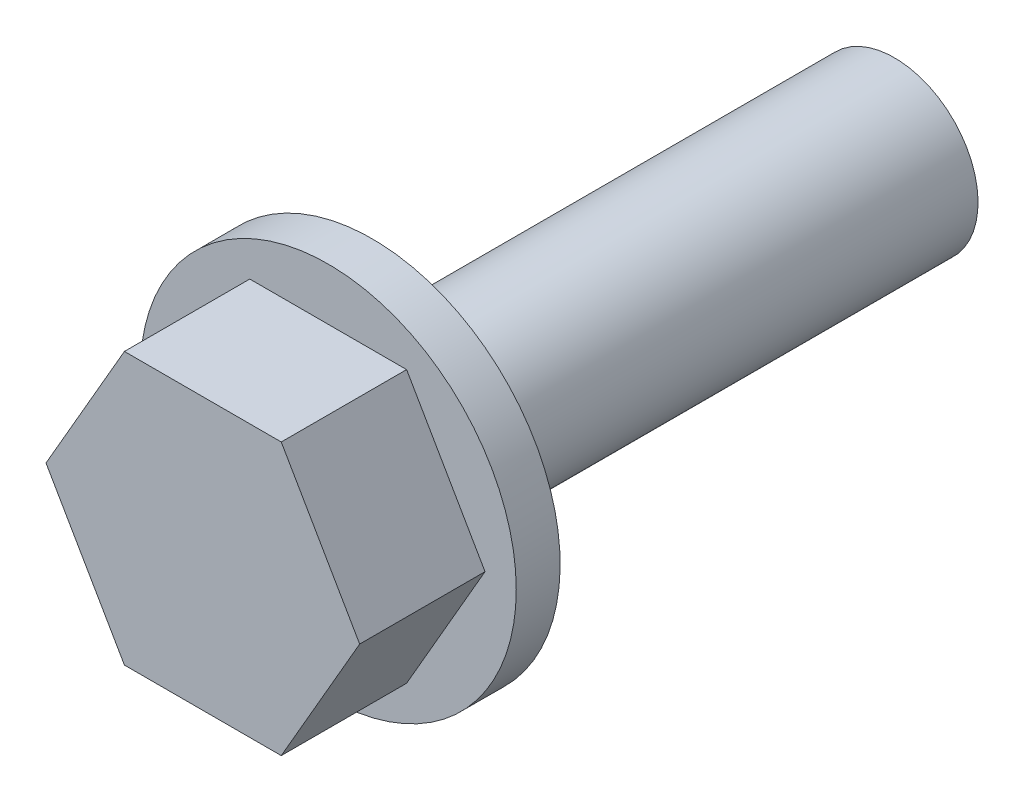
ISO-10303-21;
HEADER;
FILE_DESCRIPTION(('STEP AP214'),'2;1');
FILE_NAME('part.step','',(''),(''),'','','');
FILE_SCHEMA(('AUTOMOTIVE_DESIGN { 1 0 10303 214 1 1 1 1 }'));
ENDSEC;
DATA;
#1=APPLICATION_CONTEXT('core data for automotive mechanical design processes');
#2=APPLICATION_PROTOCOL_DEFINITION('international standard','automotive_design',2000,#1);
#3=PRODUCT_CONTEXT('',#1,'mechanical');
#4=PRODUCT('Part','Part','',(#3));
#5=PRODUCT_RELATED_PRODUCT_CATEGORY('part','',(#4));
#6=PRODUCT_DEFINITION_FORMATION('','',#4);
#7=PRODUCT_DEFINITION_CONTEXT('part definition',#1,'design');
#8=PRODUCT_DEFINITION('design','',#6,#7);
#9=PRODUCT_DEFINITION_SHAPE('','',#8);
#10=(LENGTH_UNIT() NAMED_UNIT(*) SI_UNIT(.MILLI.,.METRE.));
#11=(NAMED_UNIT(*) PLANE_ANGLE_UNIT() SI_UNIT($,.RADIAN.));
#12=(NAMED_UNIT(*) SI_UNIT($,.STERADIAN.) SOLID_ANGLE_UNIT());
#13=UNCERTAINTY_MEASURE_WITH_UNIT(LENGTH_MEASURE(1.E-05),#10,'distance_accuracy_value','');
#14=(GEOMETRIC_REPRESENTATION_CONTEXT(3) GLOBAL_UNCERTAINTY_ASSIGNED_CONTEXT((#13)) GLOBAL_UNIT_ASSIGNED_CONTEXT((#10,
#11,#12)) REPRESENTATION_CONTEXT('',''));
#15=CARTESIAN_POINT('',(0.,0.,0.));
#16=DIRECTION('',(0.,0.,1.));
#17=DIRECTION('',(1.,0.,0.));
#18=AXIS2_PLACEMENT_3D('',#15,#16,#17);
#19=CARTESIAN_POINT('',(0.,0.,5.58488227818494));
#20=DIRECTION('',(0.,0.,1.));
#21=DIRECTION('',(0.,-1.,0.));
#22=AXIS2_PLACEMENT_3D('',#19,#20,#21);
#23=CYLINDRICAL_SURFACE('',#22,9.);
#24=CARTESIAN_POINT('',(0.,0.,0.));
#25=DIRECTION('',(0.,0.,1.));
#26=DIRECTION('',(0.,-1.,0.));
#27=AXIS2_PLACEMENT_3D('',#24,#25,#26);
#28=CIRCLE('',#27,9.);
#29=CARTESIAN_POINT('',(0.,-9.,0.));
#30=VERTEX_POINT('',#29);
#31=EDGE_CURVE('E12',#30,#30,#28,.T.);
#32=ORIENTED_EDGE('',*,*,#31,.T.);
#33=EDGE_LOOP('',(#32));
#34=FACE_BOUND('',#33,.T.);
#35=CARTESIAN_POINT('',(0.,0.,2.1));
#36=DIRECTION('',(0.,0.,1.));
#37=DIRECTION('',(1.,0.,0.));
#38=AXIS2_PLACEMENT_3D('',#35,#36,#37);
#39=CIRCLE('',#38,9.);
#40=CARTESIAN_POINT('',(9.,0.,2.1));
#41=VERTEX_POINT('',#40);
#42=EDGE_CURVE('E39',#41,#41,#39,.T.);
#43=ORIENTED_EDGE('',*,*,#42,.F.);
#44=EDGE_LOOP('',(#43));
#45=FACE_BOUND('',#44,.T.);
#46=ADVANCED_FACE('F35',(#34,#45),#23,.T.);
#47=CARTESIAN_POINT('',(0.,9.,0.));
#48=DIRECTION('',(0.,0.,1.));
#49=DIRECTION('',(0.,-1.,0.));
#50=AXIS2_PLACEMENT_3D('',#47,#48,#49);
#51=PLANE('',#50);
#52=ORIENTED_EDGE('',*,*,#31,.F.);
#53=EDGE_LOOP('',(#52));
#54=FACE_BOUND('',#53,.T.);
#55=CARTESIAN_POINT('',(0.,0.,0.));
#56=DIRECTION('',(0.,0.,1.));
#57=DIRECTION('',(0.,-1.,0.));
#58=AXIS2_PLACEMENT_3D('',#55,#56,#57);
#59=CIRCLE('',#58,4.);
#60=CARTESIAN_POINT('',(0.,-4.,0.));
#61=VERTEX_POINT('',#60);
#62=EDGE_CURVE('E44',#61,#61,#59,.T.);
#63=ORIENTED_EDGE('',*,*,#62,.T.);
#64=EDGE_LOOP('',(#63));
#65=FACE_BOUND('',#64,.T.);
#66=ADVANCED_FACE('F149',(#54,#65),#51,.F.);
#67=CARTESIAN_POINT('',(0.,0.,5.58488227818494));
#68=DIRECTION('',(0.,0.,1.));
#69=DIRECTION('',(0.,-1.,0.));
#70=AXIS2_PLACEMENT_3D('',#67,#68,#69);
#71=CYLINDRICAL_SURFACE('',#70,4.);
#72=ORIENTED_EDGE('',*,*,#62,.F.);
#73=EDGE_LOOP('',(#72));
#74=FACE_BOUND('',#73,.T.);
#75=CARTESIAN_POINT('',(0.,0.,-25.));
#76=DIRECTION('',(0.,0.,1.));
#77=DIRECTION('',(0.,-1.,0.));
#78=AXIS2_PLACEMENT_3D('',#75,#76,#77);
#79=CIRCLE('',#78,4.);
#80=CARTESIAN_POINT('',(0.,-4.,-25.));
#81=VERTEX_POINT('',#80);
#82=EDGE_CURVE('E143',#81,#81,#79,.T.);
#83=ORIENTED_EDGE('',*,*,#82,.T.);
#84=EDGE_LOOP('',(#83));
#85=FACE_BOUND('',#84,.T.);
#86=ADVANCED_FACE('F151',(#74,#85),#71,.T.);
#87=CARTESIAN_POINT('',(0.,4.,-25.));
#88=DIRECTION('',(0.,0.,1.));
#89=DIRECTION('',(0.,-1.,0.));
#90=AXIS2_PLACEMENT_3D('',#87,#88,#89);
#91=PLANE('',#90);
#92=ORIENTED_EDGE('',*,*,#82,.F.);
#93=EDGE_LOOP('',(#92));
#94=FACE_BOUND('',#93,.T.);
#95=ADVANCED_FACE('F154',(#94),#91,.F.);
#96=CARTESIAN_POINT('',(0.,0.,2.1));
#97=DIRECTION('',(0.,0.,1.));
#98=DIRECTION('',(1.,0.,0.));
#99=AXIS2_PLACEMENT_3D('',#96,#97,#98);
#100=PLANE('',#99);
#101=DIRECTION('',(0.5,-0.866025403784439,0.));
#102=VECTOR('',#101,1.);
#103=CARTESIAN_POINT('',(-7.50555349946514,0.,2.1));
#104=LINE('',#103,#102);
#105=CARTESIAN_POINT('',(-7.50555349946514,0.,2.1));
#106=VERTEX_POINT('',#105);
#107=CARTESIAN_POINT('',(-3.75277674973257,-6.5,2.1));
#108=VERTEX_POINT('',#107);
#109=EDGE_CURVE('E101',#106,#108,#104,.T.);
#110=ORIENTED_EDGE('',*,*,#109,.F.);
#111=DIRECTION('',(-0.5,-0.866025403784439,0.));
#112=VECTOR('',#111,1.);
#113=CARTESIAN_POINT('',(-3.75277674973257,6.5,2.1));
#114=LINE('',#113,#112);
#115=CARTESIAN_POINT('',(-3.75277674973257,6.5,2.1));
#116=VERTEX_POINT('',#115);
#117=EDGE_CURVE('E122',#116,#106,#114,.T.);
#118=ORIENTED_EDGE('',*,*,#117,.F.);
#119=DIRECTION('',(-1.,0.,0.));
#120=VECTOR('',#119,1.);
#121=CARTESIAN_POINT('',(3.75277674973257,6.5,2.1));
#122=LINE('',#121,#120);
#123=CARTESIAN_POINT('',(3.75277674973257,6.5,2.1));
#124=VERTEX_POINT('',#123);
#125=EDGE_CURVE('E119',#124,#116,#122,.T.);
#126=ORIENTED_EDGE('',*,*,#125,.F.);
#127=DIRECTION('',(-0.5,0.866025403784439,0.));
#128=VECTOR('',#127,1.);
#129=CARTESIAN_POINT('',(7.50555349946513,0.,2.1));
#130=LINE('',#129,#128);
#131=CARTESIAN_POINT('',(7.50555349946513,0.,2.1));
#132=VERTEX_POINT('',#131);
#133=EDGE_CURVE('E59',#132,#124,#130,.T.);
#134=ORIENTED_EDGE('',*,*,#133,.F.);
#135=DIRECTION('',(0.5,0.866025403784439,0.));
#136=VECTOR('',#135,1.);
#137=CARTESIAN_POINT('',(3.75277674973257,-6.5,2.1));
#138=LINE('',#137,#136);
#139=CARTESIAN_POINT('',(3.75277674973257,-6.5,2.1));
#140=VERTEX_POINT('',#139);
#141=EDGE_CURVE('E93',#140,#132,#138,.T.);
#142=ORIENTED_EDGE('',*,*,#141,.F.);
#143=DIRECTION('',(1.,0.,0.));
#144=VECTOR('',#143,1.);
#145=CARTESIAN_POINT('',(-3.75277674973257,-6.5,2.1));
#146=LINE('',#145,#144);
#147=EDGE_CURVE('E107',#108,#140,#146,.T.);
#148=ORIENTED_EDGE('',*,*,#147,.F.);
#149=EDGE_LOOP('',(#110,#118,#126,#134,#142,#148));
#150=FACE_BOUND('',#149,.T.);
#151=ORIENTED_EDGE('',*,*,#42,.T.);
#152=EDGE_LOOP('',(#151));
#153=FACE_BOUND('',#152,.T.);
#154=ADVANCED_FACE('F105',(#150,#153),#100,.T.);
#155=CARTESIAN_POINT('',(-3.75277674973257,-6.5,2.1));
#156=DIRECTION('',(0.,-1.,0.));
#157=DIRECTION('',(0.,0.,-1.));
#158=AXIS2_PLACEMENT_3D('',#155,#156,#157);
#159=PLANE('',#158);
#160=DIRECTION('',(1.,0.,0.));
#161=VECTOR('',#160,1.);
#162=CARTESIAN_POINT('',(-3.75277674973257,-6.5,8.1));
#163=LINE('',#162,#161);
#164=CARTESIAN_POINT('',(-3.75277674973257,-6.5,8.1));
#165=VERTEX_POINT('',#164);
#166=CARTESIAN_POINT('',(3.75277674973257,-6.5,8.1));
#167=VERTEX_POINT('',#166);
#168=EDGE_CURVE('E126',#165,#167,#163,.T.);
#169=ORIENTED_EDGE('',*,*,#168,.F.);
#170=DIRECTION('',(0.,0.,1.));
#171=VECTOR('',#170,1.);
#172=CARTESIAN_POINT('',(-3.75277674973257,-6.5,2.1));
#173=LINE('',#172,#171);
#174=EDGE_CURVE('E111',#108,#165,#173,.T.);
#175=ORIENTED_EDGE('',*,*,#174,.F.);
#176=ORIENTED_EDGE('',*,*,#147,.T.);
#177=DIRECTION('',(0.,0.,1.));
#178=VECTOR('',#177,1.);
#179=CARTESIAN_POINT('',(3.75277674973257,-6.5,2.1));
#180=LINE('',#179,#178);
#181=EDGE_CURVE('E91',#140,#167,#180,.T.);
#182=ORIENTED_EDGE('',*,*,#181,.T.);
#183=EDGE_LOOP('',(#169,#175,#176,#182));
#184=FACE_BOUND('',#183,.T.);
#185=ADVANCED_FACE('F110',(#184),#159,.T.);
#186=CARTESIAN_POINT('',(-7.50555349946514,0.,2.1));
#187=DIRECTION('',(-0.866025403784439,-0.5,0.));
#188=DIRECTION('',(0.5,-0.866025403784439,0.));
#189=AXIS2_PLACEMENT_3D('',#186,#187,#188);
#190=PLANE('',#189);
#191=DIRECTION('',(0.5,-0.866025403784439,0.));
#192=VECTOR('',#191,1.);
#193=CARTESIAN_POINT('',(-7.50555349946514,0.,8.1));
#194=LINE('',#193,#192);
#195=CARTESIAN_POINT('',(-7.50555349946514,0.,8.1));
#196=VERTEX_POINT('',#195);
#197=EDGE_CURVE('E112',#196,#165,#194,.T.);
#198=ORIENTED_EDGE('',*,*,#197,.F.);
#199=DIRECTION('',(0.,0.,1.));
#200=VECTOR('',#199,1.);
#201=CARTESIAN_POINT('',(-7.50555349946514,0.,2.1));
#202=LINE('',#201,#200);
#203=EDGE_CURVE('E136',#106,#196,#202,.T.);
#204=ORIENTED_EDGE('',*,*,#203,.F.);
#205=ORIENTED_EDGE('',*,*,#109,.T.);
#206=ORIENTED_EDGE('',*,*,#174,.T.);
#207=EDGE_LOOP('',(#198,#204,#205,#206));
#208=FACE_BOUND('',#207,.T.);
#209=ADVANCED_FACE('F207',(#208),#190,.T.);
#210=CARTESIAN_POINT('',(-3.75277674973257,6.5,2.1));
#211=DIRECTION('',(-0.866025403784439,0.5,0.));
#212=DIRECTION('',(-0.5,-0.866025403784439,0.));
#213=AXIS2_PLACEMENT_3D('',#210,#211,#212);
#214=PLANE('',#213);
#215=DIRECTION('',(-0.5,-0.866025403784439,0.));
#216=VECTOR('',#215,1.);
#217=CARTESIAN_POINT('',(-3.75277674973257,6.5,8.1));
#218=LINE('',#217,#216);
#219=CARTESIAN_POINT('',(-3.75277674973257,6.5,8.1));
#220=VERTEX_POINT('',#219);
#221=EDGE_CURVE('E115',#220,#196,#218,.T.);
#222=ORIENTED_EDGE('',*,*,#221,.F.);
#223=DIRECTION('',(0.,0.,1.));
#224=VECTOR('',#223,1.);
#225=CARTESIAN_POINT('',(-3.75277674973257,6.5,2.1));
#226=LINE('',#225,#224);
#227=EDGE_CURVE('E138',#116,#220,#226,.T.);
#228=ORIENTED_EDGE('',*,*,#227,.F.);
#229=ORIENTED_EDGE('',*,*,#117,.T.);
#230=ORIENTED_EDGE('',*,*,#203,.T.);
#231=EDGE_LOOP('',(#222,#228,#229,#230));
#232=FACE_BOUND('',#231,.T.);
#233=ADVANCED_FACE('F216',(#232),#214,.T.);
#234=CARTESIAN_POINT('',(3.75277674973257,6.5,2.1));
#235=DIRECTION('',(0.,1.,0.));
#236=DIRECTION('',(-1.,0.,0.));
#237=AXIS2_PLACEMENT_3D('',#234,#235,#236);
#238=PLANE('',#237);
#239=DIRECTION('',(-1.,0.,0.));
#240=VECTOR('',#239,1.);
#241=CARTESIAN_POINT('',(3.75277674973257,6.5,8.1));
#242=LINE('',#241,#240);
#243=CARTESIAN_POINT('',(3.75277674973257,6.5,8.1));
#244=VERTEX_POINT('',#243);
#245=EDGE_CURVE('E130',#244,#220,#242,.T.);
#246=ORIENTED_EDGE('',*,*,#245,.F.);
#247=DIRECTION('',(0.,0.,1.));
#248=VECTOR('',#247,1.);
#249=CARTESIAN_POINT('',(3.75277674973257,6.5,2.1));
#250=LINE('',#249,#248);
#251=EDGE_CURVE('E140',#124,#244,#250,.T.);
#252=ORIENTED_EDGE('',*,*,#251,.F.);
#253=ORIENTED_EDGE('',*,*,#125,.T.);
#254=ORIENTED_EDGE('',*,*,#227,.T.);
#255=EDGE_LOOP('',(#246,#252,#253,#254));
#256=FACE_BOUND('',#255,.T.);
#257=ADVANCED_FACE('F226',(#256),#238,.T.);
#258=CARTESIAN_POINT('',(7.50555349946513,0.,2.1));
#259=DIRECTION('',(0.866025403784439,0.5,0.));
#260=DIRECTION('',(-0.5,0.866025403784439,0.));
#261=AXIS2_PLACEMENT_3D('',#258,#259,#260);
#262=PLANE('',#261);
#263=DIRECTION('',(-0.5,0.866025403784439,0.));
#264=VECTOR('',#263,1.);
#265=CARTESIAN_POINT('',(7.50555349946513,0.,8.1));
#266=LINE('',#265,#264);
#267=CARTESIAN_POINT('',(7.50555349946513,0.,8.1));
#268=VERTEX_POINT('',#267);
#269=EDGE_CURVE('E51',#268,#244,#266,.T.);
#270=ORIENTED_EDGE('',*,*,#269,.F.);
#271=DIRECTION('',(0.,0.,1.));
#272=VECTOR('',#271,1.);
#273=CARTESIAN_POINT('',(7.50555349946513,0.,2.1));
#274=LINE('',#273,#272);
#275=EDGE_CURVE('E100',#132,#268,#274,.T.);
#276=ORIENTED_EDGE('',*,*,#275,.F.);
#277=ORIENTED_EDGE('',*,*,#133,.T.);
#278=ORIENTED_EDGE('',*,*,#251,.T.);
#279=EDGE_LOOP('',(#270,#276,#277,#278));
#280=FACE_BOUND('',#279,.T.);
#281=ADVANCED_FACE('F236',(#280),#262,.T.);
#282=CARTESIAN_POINT('',(3.75277674973257,-6.5,2.1));
#283=DIRECTION('',(0.866025403784439,-0.5,0.));
#284=DIRECTION('',(0.5,0.866025403784439,0.));
#285=AXIS2_PLACEMENT_3D('',#282,#283,#284);
#286=PLANE('',#285);
#287=DIRECTION('',(0.5,0.866025403784439,0.));
#288=VECTOR('',#287,1.);
#289=CARTESIAN_POINT('',(3.75277674973257,-6.5,8.1));
#290=LINE('',#289,#288);
#291=EDGE_CURVE('E95',#167,#268,#290,.T.);
#292=ORIENTED_EDGE('',*,*,#291,.F.);
#293=ORIENTED_EDGE('',*,*,#181,.F.);
#294=ORIENTED_EDGE('',*,*,#141,.T.);
#295=ORIENTED_EDGE('',*,*,#275,.T.);
#296=EDGE_LOOP('',(#292,#293,#294,#295));
#297=FACE_BOUND('',#296,.T.);
#298=ADVANCED_FACE('F92',(#297),#286,.T.);
#299=CARTESIAN_POINT('',(0.,0.,8.1));
#300=DIRECTION('',(0.,0.,-1.));
#301=DIRECTION('',(0.,1.,0.));
#302=AXIS2_PLACEMENT_3D('',#299,#300,#301);
#303=PLANE('',#302);
#304=ORIENTED_EDGE('',*,*,#168,.T.);
#305=ORIENTED_EDGE('',*,*,#291,.T.);
#306=ORIENTED_EDGE('',*,*,#269,.T.);
#307=ORIENTED_EDGE('',*,*,#245,.T.);
#308=ORIENTED_EDGE('',*,*,#221,.T.);
#309=ORIENTED_EDGE('',*,*,#197,.T.);
#310=EDGE_LOOP('',(#304,#305,#306,#307,#308,#309));
#311=FACE_BOUND('',#310,.T.);
#312=ADVANCED_FACE('F37',(#311),#303,.F.);
#313=CLOSED_SHELL('',(#46,#66,#86,#95,#154,#185,#209,#233,#257,#281,#298,#312));
#314=MANIFOLD_SOLID_BREP('B2',#313);
#315=ADVANCED_BREP_SHAPE_REPRESENTATION('',(#18,#314),#14);
#316=SHAPE_DEFINITION_REPRESENTATION(#9,#315);
ENDSEC;
END-ISO-10303-21;
